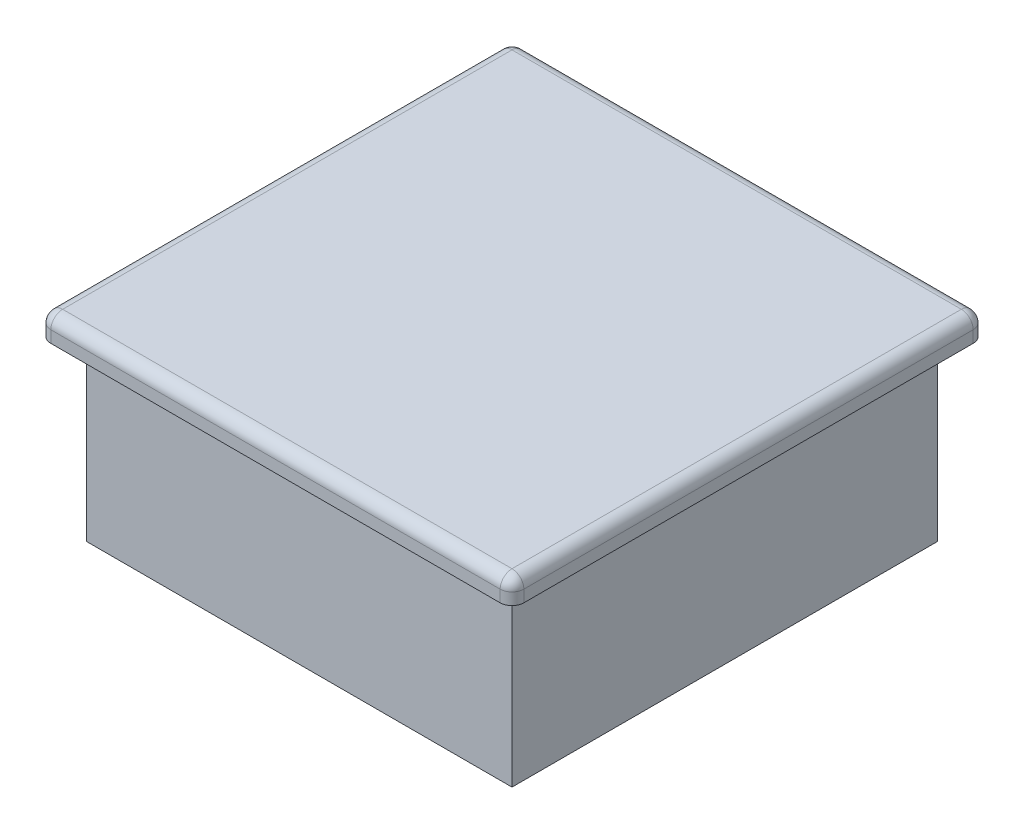
ISO-10303-21;
HEADER;
FILE_DESCRIPTION(('STEP AP214'),'2;1');
FILE_NAME('part.step','',(''),(''),'','','');
FILE_SCHEMA(('AUTOMOTIVE_DESIGN { 1 0 10303 214 1 1 1 1 }'));
ENDSEC;
DATA;
#1=APPLICATION_CONTEXT('core data for automotive mechanical design processes');
#2=APPLICATION_PROTOCOL_DEFINITION('international standard','automotive_design',2000,#1);
#3=PRODUCT_CONTEXT('',#1,'mechanical');
#4=PRODUCT('Part','Part','',(#3));
#5=PRODUCT_RELATED_PRODUCT_CATEGORY('part','',(#4));
#6=PRODUCT_DEFINITION_FORMATION('','',#4);
#7=PRODUCT_DEFINITION_CONTEXT('part definition',#1,'design');
#8=PRODUCT_DEFINITION('design','',#6,#7);
#9=PRODUCT_DEFINITION_SHAPE('','',#8);
#10=(LENGTH_UNIT() NAMED_UNIT(*) SI_UNIT(.MILLI.,.METRE.));
#11=(NAMED_UNIT(*) PLANE_ANGLE_UNIT() SI_UNIT($,.RADIAN.));
#12=(NAMED_UNIT(*) SI_UNIT($,.STERADIAN.) SOLID_ANGLE_UNIT());
#13=UNCERTAINTY_MEASURE_WITH_UNIT(LENGTH_MEASURE(1.E-05),#10,'distance_accuracy_value','');
#14=(GEOMETRIC_REPRESENTATION_CONTEXT(3) GLOBAL_UNCERTAINTY_ASSIGNED_CONTEXT((#13)) GLOBAL_UNIT_ASSIGNED_CONTEXT((#10,
#11,#12)) REPRESENTATION_CONTEXT('',''));
#15=CARTESIAN_POINT('',(0.,0.,0.));
#16=DIRECTION('',(0.,0.,1.));
#17=DIRECTION('',(1.,0.,0.));
#18=AXIS2_PLACEMENT_3D('',#15,#16,#17);
#19=CARTESIAN_POINT('',(20.,2.,-20.));
#20=DIRECTION('',(-1.,0.,0.));
#21=DIRECTION('',(0.,0.,1.));
#22=AXIS2_PLACEMENT_3D('',#19,#20,#21);
#23=PLANE('',#22);
#24=DIRECTION('',(0.,0.,-1.));
#25=VECTOR('',#24,1.);
#26=CARTESIAN_POINT('',(20.,0.,-20.));
#27=LINE('',#26,#25);
#28=CARTESIAN_POINT('',(20.,0.,19.));
#29=VERTEX_POINT('',#28);
#30=CARTESIAN_POINT('',(20.,0.,-19.));
#31=VERTEX_POINT('',#30);
#32=EDGE_CURVE('E229',#29,#31,#27,.T.);
#33=ORIENTED_EDGE('',*,*,#32,.T.);
#34=DIRECTION('',(0.,-1.,0.));
#35=VECTOR('',#34,1.);
#36=CARTESIAN_POINT('',(20.,2.,-19.));
#37=LINE('',#36,#35);
#38=CARTESIAN_POINT('',(20.,1.,-19.));
#39=VERTEX_POINT('',#38);
#40=EDGE_CURVE('E279',#31,#39,#37,.F.);
#41=ORIENTED_EDGE('',*,*,#40,.T.);
#42=DIRECTION('',(0.,0.,-1.));
#43=VECTOR('',#42,1.);
#44=CARTESIAN_POINT('',(20.,1.,20.));
#45=LINE('',#44,#43);
#46=CARTESIAN_POINT('',(20.,1.,19.));
#47=VERTEX_POINT('',#46);
#48=EDGE_CURVE('E277',#39,#47,#45,.F.);
#49=ORIENTED_EDGE('',*,*,#48,.T.);
#50=DIRECTION('',(0.,-1.,0.));
#51=VECTOR('',#50,1.);
#52=CARTESIAN_POINT('',(20.,2.,19.));
#53=LINE('',#52,#51);
#54=EDGE_CURVE('E275',#47,#29,#53,.T.);
#55=ORIENTED_EDGE('',*,*,#54,.T.);
#56=EDGE_LOOP('',(#33,#41,#49,#55));
#57=FACE_BOUND('',#56,.T.);
#58=ADVANCED_FACE('F35',(#57),#23,.F.);
#59=CARTESIAN_POINT('',(-20.,2.,-20.));
#60=DIRECTION('',(0.,0.,1.));
#61=DIRECTION('',(1.,0.,0.));
#62=AXIS2_PLACEMENT_3D('',#59,#60,#61);
#63=PLANE('',#62);
#64=DIRECTION('',(-1.,0.,0.));
#65=VECTOR('',#64,1.);
#66=CARTESIAN_POINT('',(-20.,0.,-20.));
#67=LINE('',#66,#65);
#68=CARTESIAN_POINT('',(19.,0.,-20.));
#69=VERTEX_POINT('',#68);
#70=CARTESIAN_POINT('',(-19.,0.,-20.));
#71=VERTEX_POINT('',#70);
#72=EDGE_CURVE('E237',#69,#71,#67,.T.);
#73=ORIENTED_EDGE('',*,*,#72,.T.);
#74=DIRECTION('',(0.,-1.,0.));
#75=VECTOR('',#74,1.);
#76=CARTESIAN_POINT('',(-19.,2.,-20.));
#77=LINE('',#76,#75);
#78=CARTESIAN_POINT('',(-19.,1.,-20.));
#79=VERTEX_POINT('',#78);
#80=EDGE_CURVE('E11',#71,#79,#77,.F.);
#81=ORIENTED_EDGE('',*,*,#80,.T.);
#82=DIRECTION('',(-1.,0.,0.));
#83=VECTOR('',#82,1.);
#84=CARTESIAN_POINT('',(20.,1.,-20.));
#85=LINE('',#84,#83);
#86=CARTESIAN_POINT('',(19.,1.,-20.));
#87=VERTEX_POINT('',#86);
#88=EDGE_CURVE('E44',#79,#87,#85,.F.);
#89=ORIENTED_EDGE('',*,*,#88,.T.);
#90=DIRECTION('',(0.,-1.,0.));
#91=VECTOR('',#90,1.);
#92=CARTESIAN_POINT('',(19.,2.,-20.));
#93=LINE('',#92,#91);
#94=EDGE_CURVE('E281',#87,#69,#93,.T.);
#95=ORIENTED_EDGE('',*,*,#94,.T.);
#96=EDGE_LOOP('',(#73,#81,#89,#95));
#97=FACE_BOUND('',#96,.T.);
#98=ADVANCED_FACE('F327',(#97),#63,.F.);
#99=CARTESIAN_POINT('',(-20.,2.,-20.));
#100=DIRECTION('',(1.,0.,0.));
#101=DIRECTION('',(0.,0.,-1.));
#102=AXIS2_PLACEMENT_3D('',#99,#100,#101);
#103=PLANE('',#102);
#104=DIRECTION('',(0.,0.,1.));
#105=VECTOR('',#104,1.);
#106=CARTESIAN_POINT('',(-20.,0.,-20.));
#107=LINE('',#106,#105);
#108=CARTESIAN_POINT('',(-20.,0.,-19.));
#109=VERTEX_POINT('',#108);
#110=CARTESIAN_POINT('',(-20.,0.,19.));
#111=VERTEX_POINT('',#110);
#112=EDGE_CURVE('E239',#109,#111,#107,.T.);
#113=ORIENTED_EDGE('',*,*,#112,.T.);
#114=DIRECTION('',(0.,-1.,0.));
#115=VECTOR('',#114,1.);
#116=CARTESIAN_POINT('',(-20.,2.,19.));
#117=LINE('',#116,#115);
#118=CARTESIAN_POINT('',(-20.,1.,19.));
#119=VERTEX_POINT('',#118);
#120=EDGE_CURVE('E264',#111,#119,#117,.F.);
#121=ORIENTED_EDGE('',*,*,#120,.T.);
#122=DIRECTION('',(0.,0.,1.));
#123=VECTOR('',#122,1.);
#124=CARTESIAN_POINT('',(-20.,1.,-20.));
#125=LINE('',#124,#123);
#126=CARTESIAN_POINT('',(-20.,1.,-19.));
#127=VERTEX_POINT('',#126);
#128=EDGE_CURVE('E262',#119,#127,#125,.F.);
#129=ORIENTED_EDGE('',*,*,#128,.T.);
#130=DIRECTION('',(0.,-1.,0.));
#131=VECTOR('',#130,1.);
#132=CARTESIAN_POINT('',(-20.,2.,-19.));
#133=LINE('',#132,#131);
#134=EDGE_CURVE('E260',#127,#109,#133,.T.);
#135=ORIENTED_EDGE('',*,*,#134,.T.);
#136=EDGE_LOOP('',(#113,#121,#129,#135));
#137=FACE_BOUND('',#136,.T.);
#138=ADVANCED_FACE('F373',(#137),#103,.F.);
#139=CARTESIAN_POINT('',(-20.,2.,20.));
#140=DIRECTION('',(0.,0.,-1.));
#141=DIRECTION('',(-1.,0.,0.));
#142=AXIS2_PLACEMENT_3D('',#139,#140,#141);
#143=PLANE('',#142);
#144=DIRECTION('',(1.,0.,0.));
#145=VECTOR('',#144,1.);
#146=CARTESIAN_POINT('',(-20.,1.,20.));
#147=LINE('',#146,#145);
#148=CARTESIAN_POINT('',(19.,1.,20.));
#149=VERTEX_POINT('',#148);
#150=CARTESIAN_POINT('',(-19.,1.,20.));
#151=VERTEX_POINT('',#150);
#152=EDGE_CURVE('E247',#149,#151,#147,.F.);
#153=ORIENTED_EDGE('',*,*,#152,.T.);
#154=DIRECTION('',(0.,-1.,0.));
#155=VECTOR('',#154,1.);
#156=CARTESIAN_POINT('',(-19.,2.,20.));
#157=LINE('',#156,#155);
#158=CARTESIAN_POINT('',(-19.,0.,20.));
#159=VERTEX_POINT('',#158);
#160=EDGE_CURVE('E249',#151,#159,#157,.T.);
#161=ORIENTED_EDGE('',*,*,#160,.T.);
#162=DIRECTION('',(1.,0.,0.));
#163=VECTOR('',#162,1.);
#164=CARTESIAN_POINT('',(-20.,0.,20.));
#165=LINE('',#164,#163);
#166=CARTESIAN_POINT('',(19.,0.,20.));
#167=VERTEX_POINT('',#166);
#168=EDGE_CURVE('E242',#159,#167,#165,.T.);
#169=ORIENTED_EDGE('',*,*,#168,.T.);
#170=DIRECTION('',(0.,-1.,0.));
#171=VECTOR('',#170,1.);
#172=CARTESIAN_POINT('',(19.,2.,20.));
#173=LINE('',#172,#171);
#174=EDGE_CURVE('E245',#167,#149,#173,.F.);
#175=ORIENTED_EDGE('',*,*,#174,.T.);
#176=EDGE_LOOP('',(#153,#161,#169,#175));
#177=FACE_BOUND('',#176,.T.);
#178=ADVANCED_FACE('F362',(#177),#143,.F.);
#179=CARTESIAN_POINT('',(0.,2.,0.));
#180=DIRECTION('',(0.,1.,0.));
#181=DIRECTION('',(0.,0.,1.));
#182=AXIS2_PLACEMENT_3D('',#179,#180,#181);
#183=PLANE('',#182);
#184=DIRECTION('',(1.,0.,0.));
#185=VECTOR('',#184,1.);
#186=CARTESIAN_POINT('',(20.,2.,19.));
#187=LINE('',#186,#185);
#188=CARTESIAN_POINT('',(-19.,2.,19.));
#189=VERTEX_POINT('',#188);
#190=CARTESIAN_POINT('',(19.,2.,19.));
#191=VERTEX_POINT('',#190);
#192=EDGE_CURVE('E270',#189,#191,#187,.T.);
#193=ORIENTED_EDGE('',*,*,#192,.T.);
#194=DIRECTION('',(0.,0.,-1.));
#195=VECTOR('',#194,1.);
#196=CARTESIAN_POINT('',(19.,2.,-20.));
#197=LINE('',#196,#195);
#198=CARTESIAN_POINT('',(19.,2.,-19.));
#199=VERTEX_POINT('',#198);
#200=EDGE_CURVE('E272',#191,#199,#197,.T.);
#201=ORIENTED_EDGE('',*,*,#200,.T.);
#202=DIRECTION('',(-1.,0.,0.));
#203=VECTOR('',#202,1.);
#204=CARTESIAN_POINT('',(-20.,2.,-19.));
#205=LINE('',#204,#203);
#206=CARTESIAN_POINT('',(-19.,2.,-19.));
#207=VERTEX_POINT('',#206);
#208=EDGE_CURVE('E266',#199,#207,#205,.T.);
#209=ORIENTED_EDGE('',*,*,#208,.T.);
#210=DIRECTION('',(0.,0.,1.));
#211=VECTOR('',#210,1.);
#212=CARTESIAN_POINT('',(-19.,2.,20.));
#213=LINE('',#212,#211);
#214=EDGE_CURVE('E268',#207,#189,#213,.T.);
#215=ORIENTED_EDGE('',*,*,#214,.T.);
#216=EDGE_LOOP('',(#193,#201,#209,#215));
#217=FACE_BOUND('',#216,.T.);
#218=ADVANCED_FACE('F345',(#217),#183,.T.);
#219=CARTESIAN_POINT('',(0.,0.,0.));
#220=DIRECTION('',(0.,1.,0.));
#221=DIRECTION('',(0.,0.,1.));
#222=AXIS2_PLACEMENT_3D('',#219,#220,#221);
#223=PLANE('',#222);
#224=DIRECTION('',(1.,0.,0.));
#225=VECTOR('',#224,1.);
#226=CARTESIAN_POINT('',(0.,0.,18.));
#227=LINE('',#226,#225);
#228=CARTESIAN_POINT('',(-18.,0.,18.));
#229=VERTEX_POINT('',#228);
#230=CARTESIAN_POINT('',(18.,0.,18.));
#231=VERTEX_POINT('',#230);
#232=EDGE_CURVE('E202',#229,#231,#227,.T.);
#233=ORIENTED_EDGE('',*,*,#232,.T.);
#234=DIRECTION('',(0.,0.,-1.));
#235=VECTOR('',#234,1.);
#236=CARTESIAN_POINT('',(18.,0.,0.));
#237=LINE('',#236,#235);
#238=CARTESIAN_POINT('',(18.,0.,-18.));
#239=VERTEX_POINT('',#238);
#240=EDGE_CURVE('E164',#231,#239,#237,.T.);
#241=ORIENTED_EDGE('',*,*,#240,.T.);
#242=DIRECTION('',(1.,0.,0.));
#243=VECTOR('',#242,1.);
#244=CARTESIAN_POINT('',(0.,0.,-18.));
#245=LINE('',#244,#243);
#246=CARTESIAN_POINT('',(-18.,0.,-18.));
#247=VERTEX_POINT('',#246);
#248=EDGE_CURVE('E207',#247,#239,#245,.T.);
#249=ORIENTED_EDGE('',*,*,#248,.F.);
#250=DIRECTION('',(0.,0.,-1.));
#251=VECTOR('',#250,1.);
#252=CARTESIAN_POINT('',(-18.,0.,0.));
#253=LINE('',#252,#251);
#254=EDGE_CURVE('E204',#229,#247,#253,.T.);
#255=ORIENTED_EDGE('',*,*,#254,.F.);
#256=EDGE_LOOP('',(#233,#241,#249,#255));
#257=FACE_BOUND('',#256,.T.);
#258=ORIENTED_EDGE('',*,*,#168,.F.);
#259=CARTESIAN_POINT('',(-19.,0.,19.));
#260=DIRECTION('',(0.,1.,0.));
#261=DIRECTION('',(0.,0.,1.));
#262=AXIS2_PLACEMENT_3D('',#259,#260,#261);
#263=CIRCLE('',#262,1.);
#264=EDGE_CURVE('E258',#159,#111,#263,.F.);
#265=ORIENTED_EDGE('',*,*,#264,.T.);
#266=ORIENTED_EDGE('',*,*,#112,.F.);
#267=CARTESIAN_POINT('',(-19.,0.,-19.));
#268=DIRECTION('',(0.,1.,0.));
#269=DIRECTION('',(0.,0.,1.));
#270=AXIS2_PLACEMENT_3D('',#267,#268,#269);
#271=CIRCLE('',#270,1.);
#272=EDGE_CURVE('E256',#109,#71,#271,.F.);
#273=ORIENTED_EDGE('',*,*,#272,.T.);
#274=ORIENTED_EDGE('',*,*,#72,.F.);
#275=CARTESIAN_POINT('',(19.,0.,-19.));
#276=DIRECTION('',(0.,1.,0.));
#277=DIRECTION('',(0.,0.,1.));
#278=AXIS2_PLACEMENT_3D('',#275,#276,#277);
#279=CIRCLE('',#278,1.);
#280=EDGE_CURVE('E254',#69,#31,#279,.F.);
#281=ORIENTED_EDGE('',*,*,#280,.T.);
#282=ORIENTED_EDGE('',*,*,#32,.F.);
#283=CARTESIAN_POINT('',(19.,0.,19.));
#284=DIRECTION('',(0.,1.,0.));
#285=DIRECTION('',(0.,0.,1.));
#286=AXIS2_PLACEMENT_3D('',#283,#284,#285);
#287=CIRCLE('',#286,1.);
#288=EDGE_CURVE('E252',#29,#167,#287,.F.);
#289=ORIENTED_EDGE('',*,*,#288,.T.);
#290=EDGE_LOOP('',(#258,#265,#266,#273,#274,#281,#282,#289));
#291=FACE_BOUND('',#290,.T.);
#292=ADVANCED_FACE('F330',(#257,#291),#223,.F.);
#293=CARTESIAN_POINT('',(0.,-15.,-16.));
#294=DIRECTION('',(0.,0.,-1.));
#295=DIRECTION('',(-1.,0.,0.));
#296=AXIS2_PLACEMENT_3D('',#293,#294,#295);
#297=PLANE('',#296);
#298=DIRECTION('',(-1.,0.,0.));
#299=VECTOR('',#298,1.);
#300=CARTESIAN_POINT('',(0.,0.,-16.));
#301=LINE('',#300,#299);
#302=CARTESIAN_POINT('',(16.,0.,-16.));
#303=VERTEX_POINT('',#302);
#304=CARTESIAN_POINT('',(-16.,0.,-16.));
#305=VERTEX_POINT('',#304);
#306=EDGE_CURVE('E210',#303,#305,#301,.T.);
#307=ORIENTED_EDGE('',*,*,#306,.T.);
#308=DIRECTION('',(0.,1.,0.));
#309=VECTOR('',#308,1.);
#310=CARTESIAN_POINT('',(-16.,-15.,-16.));
#311=LINE('',#310,#309);
#312=CARTESIAN_POINT('',(-16.,-15.,-16.));
#313=VERTEX_POINT('',#312);
#314=EDGE_CURVE('E227',#313,#305,#311,.T.);
#315=ORIENTED_EDGE('',*,*,#314,.F.);
#316=DIRECTION('',(-1.,0.,0.));
#317=VECTOR('',#316,1.);
#318=CARTESIAN_POINT('',(0.,-15.,-16.));
#319=LINE('',#318,#317);
#320=CARTESIAN_POINT('',(16.,-15.,-16.));
#321=VERTEX_POINT('',#320);
#322=EDGE_CURVE('E189',#321,#313,#319,.T.);
#323=ORIENTED_EDGE('',*,*,#322,.F.);
#324=DIRECTION('',(0.,1.,0.));
#325=VECTOR('',#324,1.);
#326=CARTESIAN_POINT('',(16.,-15.,-16.));
#327=LINE('',#326,#325);
#328=EDGE_CURVE('E168',#321,#303,#327,.T.);
#329=ORIENTED_EDGE('',*,*,#328,.T.);
#330=EDGE_LOOP('',(#307,#315,#323,#329));
#331=FACE_BOUND('',#330,.T.);
#332=ADVANCED_FACE('F540',(#331),#297,.F.);
#333=CARTESIAN_POINT('',(-16.,-15.,0.));
#334=DIRECTION('',(-1.,0.,0.));
#335=DIRECTION('',(0.,0.,1.));
#336=AXIS2_PLACEMENT_3D('',#333,#334,#335);
#337=PLANE('',#336);
#338=DIRECTION('',(0.,0.,1.));
#339=VECTOR('',#338,1.);
#340=CARTESIAN_POINT('',(-16.,0.,0.));
#341=LINE('',#340,#339);
#342=CARTESIAN_POINT('',(-16.,0.,16.));
#343=VERTEX_POINT('',#342);
#344=EDGE_CURVE('E213',#305,#343,#341,.T.);
#345=ORIENTED_EDGE('',*,*,#344,.T.);
#346=DIRECTION('',(0.,1.,0.));
#347=VECTOR('',#346,1.);
#348=CARTESIAN_POINT('',(-16.,-15.,16.));
#349=LINE('',#348,#347);
#350=CARTESIAN_POINT('',(-16.,-15.,16.));
#351=VERTEX_POINT('',#350);
#352=EDGE_CURVE('E225',#351,#343,#349,.T.);
#353=ORIENTED_EDGE('',*,*,#352,.F.);
#354=DIRECTION('',(0.,0.,1.));
#355=VECTOR('',#354,1.);
#356=CARTESIAN_POINT('',(-16.,-15.,0.));
#357=LINE('',#356,#355);
#358=EDGE_CURVE('E192',#313,#351,#357,.T.);
#359=ORIENTED_EDGE('',*,*,#358,.F.);
#360=ORIENTED_EDGE('',*,*,#314,.T.);
#361=EDGE_LOOP('',(#345,#353,#359,#360));
#362=FACE_BOUND('',#361,.T.);
#363=ADVANCED_FACE('F531',(#362),#337,.F.);
#364=CARTESIAN_POINT('',(0.,-15.,16.));
#365=DIRECTION('',(0.,0.,-1.));
#366=DIRECTION('',(-1.,0.,0.));
#367=AXIS2_PLACEMENT_3D('',#364,#365,#366);
#368=PLANE('',#367);
#369=DIRECTION('',(-1.,0.,0.));
#370=VECTOR('',#369,1.);
#371=CARTESIAN_POINT('',(0.,0.,16.));
#372=LINE('',#371,#370);
#373=CARTESIAN_POINT('',(16.,0.,16.));
#374=VERTEX_POINT('',#373);
#375=EDGE_CURVE('E216',#374,#343,#372,.T.);
#376=ORIENTED_EDGE('',*,*,#375,.F.);
#377=DIRECTION('',(0.,1.,0.));
#378=VECTOR('',#377,1.);
#379=CARTESIAN_POINT('',(16.,-15.,16.));
#380=LINE('',#379,#378);
#381=CARTESIAN_POINT('',(16.,-15.,16.));
#382=VERTEX_POINT('',#381);
#383=EDGE_CURVE('E222',#382,#374,#380,.T.);
#384=ORIENTED_EDGE('',*,*,#383,.F.);
#385=DIRECTION('',(-1.,0.,0.));
#386=VECTOR('',#385,1.);
#387=CARTESIAN_POINT('',(0.,-15.,16.));
#388=LINE('',#387,#386);
#389=EDGE_CURVE('E194',#382,#351,#388,.T.);
#390=ORIENTED_EDGE('',*,*,#389,.T.);
#391=ORIENTED_EDGE('',*,*,#352,.T.);
#392=EDGE_LOOP('',(#376,#384,#390,#391));
#393=FACE_BOUND('',#392,.T.);
#394=ADVANCED_FACE('F523',(#393),#368,.T.);
#395=CARTESIAN_POINT('',(18.,-15.,0.));
#396=DIRECTION('',(1.,0.,0.));
#397=DIRECTION('',(0.,0.,-1.));
#398=AXIS2_PLACEMENT_3D('',#395,#396,#397);
#399=PLANE('',#398);
#400=ORIENTED_EDGE('',*,*,#240,.F.);
#401=DIRECTION('',(0.,1.,0.));
#402=VECTOR('',#401,1.);
#403=CARTESIAN_POINT('',(18.,-15.,18.));
#404=LINE('',#403,#402);
#405=CARTESIAN_POINT('',(18.,-15.,18.));
#406=VERTEX_POINT('',#405);
#407=EDGE_CURVE('E159',#406,#231,#404,.T.);
#408=ORIENTED_EDGE('',*,*,#407,.F.);
#409=DIRECTION('',(0.,0.,-1.));
#410=VECTOR('',#409,1.);
#411=CARTESIAN_POINT('',(18.,-15.,0.));
#412=LINE('',#411,#410);
#413=CARTESIAN_POINT('',(18.,-15.,-18.));
#414=VERTEX_POINT('',#413);
#415=EDGE_CURVE('E163',#406,#414,#412,.T.);
#416=ORIENTED_EDGE('',*,*,#415,.T.);
#417=DIRECTION('',(0.,1.,0.));
#418=VECTOR('',#417,1.);
#419=CARTESIAN_POINT('',(18.,-15.,-18.));
#420=LINE('',#419,#418);
#421=EDGE_CURVE('E200',#414,#239,#420,.T.);
#422=ORIENTED_EDGE('',*,*,#421,.T.);
#423=EDGE_LOOP('',(#400,#408,#416,#422));
#424=FACE_BOUND('',#423,.T.);
#425=ADVANCED_FACE('F161',(#424),#399,.T.);
#426=CARTESIAN_POINT('',(0.,-15.,18.));
#427=DIRECTION('',(0.,0.,1.));
#428=DIRECTION('',(1.,0.,0.));
#429=AXIS2_PLACEMENT_3D('',#426,#427,#428);
#430=PLANE('',#429);
#431=ORIENTED_EDGE('',*,*,#232,.F.);
#432=DIRECTION('',(0.,1.,0.));
#433=VECTOR('',#432,1.);
#434=CARTESIAN_POINT('',(-18.,-15.,18.));
#435=LINE('',#434,#433);
#436=CARTESIAN_POINT('',(-18.,-15.,18.));
#437=VERTEX_POINT('',#436);
#438=EDGE_CURVE('E169',#437,#229,#435,.T.);
#439=ORIENTED_EDGE('',*,*,#438,.F.);
#440=DIRECTION('',(1.,0.,0.));
#441=VECTOR('',#440,1.);
#442=CARTESIAN_POINT('',(0.,-15.,18.));
#443=LINE('',#442,#441);
#444=EDGE_CURVE('E175',#437,#406,#443,.T.);
#445=ORIENTED_EDGE('',*,*,#444,.T.);
#446=ORIENTED_EDGE('',*,*,#407,.T.);
#447=EDGE_LOOP('',(#431,#439,#445,#446));
#448=FACE_BOUND('',#447,.T.);
#449=ADVANCED_FACE('F181',(#448),#430,.T.);
#450=CARTESIAN_POINT('',(-18.,-15.,0.));
#451=DIRECTION('',(1.,0.,0.));
#452=DIRECTION('',(0.,0.,-1.));
#453=AXIS2_PLACEMENT_3D('',#450,#451,#452);
#454=PLANE('',#453);
#455=ORIENTED_EDGE('',*,*,#254,.T.);
#456=DIRECTION('',(0.,1.,0.));
#457=VECTOR('',#456,1.);
#458=CARTESIAN_POINT('',(-18.,-15.,-18.));
#459=LINE('',#458,#457);
#460=CARTESIAN_POINT('',(-18.,-15.,-18.));
#461=VERTEX_POINT('',#460);
#462=EDGE_CURVE('E231',#461,#247,#459,.T.);
#463=ORIENTED_EDGE('',*,*,#462,.F.);
#464=DIRECTION('',(0.,0.,-1.));
#465=VECTOR('',#464,1.);
#466=CARTESIAN_POINT('',(-18.,-15.,0.));
#467=LINE('',#466,#465);
#468=EDGE_CURVE('E184',#437,#461,#467,.T.);
#469=ORIENTED_EDGE('',*,*,#468,.F.);
#470=ORIENTED_EDGE('',*,*,#438,.T.);
#471=EDGE_LOOP('',(#455,#463,#469,#470));
#472=FACE_BOUND('',#471,.T.);
#473=ADVANCED_FACE('F499',(#472),#454,.F.);
#474=CARTESIAN_POINT('',(0.,-15.,-18.));
#475=DIRECTION('',(0.,0.,1.));
#476=DIRECTION('',(1.,0.,0.));
#477=AXIS2_PLACEMENT_3D('',#474,#475,#476);
#478=PLANE('',#477);
#479=ORIENTED_EDGE('',*,*,#248,.T.);
#480=ORIENTED_EDGE('',*,*,#421,.F.);
#481=DIRECTION('',(1.,0.,0.));
#482=VECTOR('',#481,1.);
#483=CARTESIAN_POINT('',(0.,-15.,-18.));
#484=LINE('',#483,#482);
#485=EDGE_CURVE('E177',#461,#414,#484,.T.);
#486=ORIENTED_EDGE('',*,*,#485,.F.);
#487=ORIENTED_EDGE('',*,*,#462,.T.);
#488=EDGE_LOOP('',(#479,#480,#486,#487));
#489=FACE_BOUND('',#488,.T.);
#490=ADVANCED_FACE('F490',(#489),#478,.F.);
#491=CARTESIAN_POINT('',(16.,-15.,0.));
#492=DIRECTION('',(-1.,0.,0.));
#493=DIRECTION('',(0.,0.,1.));
#494=AXIS2_PLACEMENT_3D('',#491,#492,#493);
#495=PLANE('',#494);
#496=DIRECTION('',(0.,0.,1.));
#497=VECTOR('',#496,1.);
#498=CARTESIAN_POINT('',(16.,0.,0.));
#499=LINE('',#498,#497);
#500=EDGE_CURVE('E179',#303,#374,#499,.T.);
#501=ORIENTED_EDGE('',*,*,#500,.F.);
#502=ORIENTED_EDGE('',*,*,#328,.F.);
#503=DIRECTION('',(0.,0.,1.));
#504=VECTOR('',#503,1.);
#505=CARTESIAN_POINT('',(16.,-15.,0.));
#506=LINE('',#505,#504);
#507=EDGE_CURVE('E197',#321,#382,#506,.T.);
#508=ORIENTED_EDGE('',*,*,#507,.T.);
#509=ORIENTED_EDGE('',*,*,#383,.T.);
#510=EDGE_LOOP('',(#501,#502,#508,#509));
#511=FACE_BOUND('',#510,.T.);
#512=ADVANCED_FACE('F481',(#511),#495,.T.);
#513=CARTESIAN_POINT('',(0.,-15.,0.));
#514=DIRECTION('',(0.,-1.,0.));
#515=DIRECTION('',(0.,0.,-1.));
#516=AXIS2_PLACEMENT_3D('',#513,#514,#515);
#517=PLANE('',#516);
#518=ORIENTED_EDGE('',*,*,#415,.F.);
#519=ORIENTED_EDGE('',*,*,#444,.F.);
#520=ORIENTED_EDGE('',*,*,#468,.T.);
#521=ORIENTED_EDGE('',*,*,#485,.T.);
#522=EDGE_LOOP('',(#518,#519,#520,#521));
#523=FACE_BOUND('',#522,.T.);
#524=ORIENTED_EDGE('',*,*,#322,.T.);
#525=ORIENTED_EDGE('',*,*,#358,.T.);
#526=ORIENTED_EDGE('',*,*,#389,.F.);
#527=ORIENTED_EDGE('',*,*,#507,.F.);
#528=EDGE_LOOP('',(#524,#525,#526,#527));
#529=FACE_BOUND('',#528,.T.);
#530=ADVANCED_FACE('F173',(#523,#529),#517,.T.);
#531=ORIENTED_EDGE('',*,*,#306,.F.);
#532=ORIENTED_EDGE('',*,*,#500,.T.);
#533=ORIENTED_EDGE('',*,*,#375,.T.);
#534=ORIENTED_EDGE('',*,*,#344,.F.);
#535=EDGE_LOOP('',(#531,#532,#533,#534));
#536=FACE_BOUND('',#535,.T.);
#537=ADVANCED_FACE('F473',(#536),#223,.F.);
#538=CARTESIAN_POINT('',(19.,2.,-19.));
#539=DIRECTION('',(0.,-1.,0.));
#540=DIRECTION('',(0.,0.,-1.));
#541=AXIS2_PLACEMENT_3D('',#538,#539,#540);
#542=CYLINDRICAL_SURFACE('',#541,1.);
#543=CARTESIAN_POINT('',(19.,1.,-19.));
#544=DIRECTION('',(0.,1.,0.));
#545=DIRECTION('',(0.,0.,1.));
#546=AXIS2_PLACEMENT_3D('',#543,#544,#545);
#547=CIRCLE('',#546,1.);
#548=EDGE_CURVE('E39',#39,#87,#547,.T.);
#549=ORIENTED_EDGE('',*,*,#548,.F.);
#550=ORIENTED_EDGE('',*,*,#40,.F.);
#551=ORIENTED_EDGE('',*,*,#280,.F.);
#552=ORIENTED_EDGE('',*,*,#94,.F.);
#553=EDGE_LOOP('',(#549,#550,#551,#552));
#554=FACE_BOUND('',#553,.T.);
#555=ADVANCED_FACE('F37',(#554),#542,.T.);
#556=CARTESIAN_POINT('',(19.,1.,-19.));
#557=DIRECTION('',(0.,0.,1.));
#558=DIRECTION('',(1.,0.,0.));
#559=AXIS2_PLACEMENT_3D('',#556,#557,#558);
#560=SPHERICAL_SURFACE('',#559,1.);
#561=CARTESIAN_POINT('',(19.,1.,-19.));
#562=DIRECTION('',(0.,0.,-1.));
#563=DIRECTION('',(-1.,0.,0.));
#564=AXIS2_PLACEMENT_3D('',#561,#562,#563);
#565=CIRCLE('',#564,1.);
#566=EDGE_CURVE('E311',#39,#199,#565,.F.);
#567=ORIENTED_EDGE('',*,*,#566,.F.);
#568=ORIENTED_EDGE('',*,*,#548,.T.);
#569=CARTESIAN_POINT('',(19.,1.,-19.));
#570=DIRECTION('',(1.,0.,0.));
#571=DIRECTION('',(0.,0.,-1.));
#572=AXIS2_PLACEMENT_3D('',#569,#570,#571);
#573=CIRCLE('',#572,1.);
#574=EDGE_CURVE('E313',#199,#87,#573,.F.);
#575=ORIENTED_EDGE('',*,*,#574,.F.);
#576=EDGE_LOOP('',(#567,#568,#575));
#577=FACE_BOUND('',#576,.T.);
#578=ADVANCED_FACE('F321',(#577),#560,.T.);
#579=CARTESIAN_POINT('',(-19.,2.,-19.));
#580=DIRECTION('',(0.,-1.,0.));
#581=DIRECTION('',(0.,0.,-1.));
#582=AXIS2_PLACEMENT_3D('',#579,#580,#581);
#583=CYLINDRICAL_SURFACE('',#582,1.);
#584=ORIENTED_EDGE('',*,*,#272,.F.);
#585=ORIENTED_EDGE('',*,*,#134,.F.);
#586=CARTESIAN_POINT('',(-19.,1.,-19.));
#587=DIRECTION('',(0.,1.,0.));
#588=DIRECTION('',(0.,0.,1.));
#589=AXIS2_PLACEMENT_3D('',#586,#587,#588);
#590=CIRCLE('',#589,1.);
#591=EDGE_CURVE('E308',#79,#127,#590,.T.);
#592=ORIENTED_EDGE('',*,*,#591,.F.);
#593=ORIENTED_EDGE('',*,*,#80,.F.);
#594=EDGE_LOOP('',(#584,#585,#592,#593));
#595=FACE_BOUND('',#594,.T.);
#596=ADVANCED_FACE('F336',(#595),#583,.T.);
#597=CARTESIAN_POINT('',(0.,1.,-19.));
#598=DIRECTION('',(1.,0.,0.));
#599=DIRECTION('',(0.,0.,-1.));
#600=AXIS2_PLACEMENT_3D('',#597,#598,#599);
#601=CYLINDRICAL_SURFACE('',#600,1.);
#602=ORIENTED_EDGE('',*,*,#574,.T.);
#603=ORIENTED_EDGE('',*,*,#88,.F.);
#604=CARTESIAN_POINT('',(-19.,1.,-19.));
#605=DIRECTION('',(-1.,0.,0.));
#606=DIRECTION('',(0.,0.,1.));
#607=AXIS2_PLACEMENT_3D('',#604,#605,#606);
#608=CIRCLE('',#607,1.);
#609=EDGE_CURVE('E305',#207,#79,#608,.T.);
#610=ORIENTED_EDGE('',*,*,#609,.F.);
#611=ORIENTED_EDGE('',*,*,#208,.F.);
#612=EDGE_LOOP('',(#602,#603,#610,#611));
#613=FACE_BOUND('',#612,.T.);
#614=ADVANCED_FACE('F343',(#613),#601,.T.);
#615=CARTESIAN_POINT('',(19.,1.,0.));
#616=DIRECTION('',(0.,0.,1.));
#617=DIRECTION('',(1.,0.,0.));
#618=AXIS2_PLACEMENT_3D('',#615,#616,#617);
#619=CYLINDRICAL_SURFACE('',#618,1.);
#620=ORIENTED_EDGE('',*,*,#566,.T.);
#621=ORIENTED_EDGE('',*,*,#200,.F.);
#622=CARTESIAN_POINT('',(19.,1.,19.));
#623=DIRECTION('',(0.,0.,1.));
#624=DIRECTION('',(1.,0.,0.));
#625=AXIS2_PLACEMENT_3D('',#622,#623,#624);
#626=CIRCLE('',#625,1.);
#627=EDGE_CURVE('E302',#47,#191,#626,.T.);
#628=ORIENTED_EDGE('',*,*,#627,.F.);
#629=ORIENTED_EDGE('',*,*,#48,.F.);
#630=EDGE_LOOP('',(#620,#621,#628,#629));
#631=FACE_BOUND('',#630,.T.);
#632=ADVANCED_FACE('F350',(#631),#619,.T.);
#633=CARTESIAN_POINT('',(19.,2.,19.));
#634=DIRECTION('',(0.,-1.,0.));
#635=DIRECTION('',(0.,0.,-1.));
#636=AXIS2_PLACEMENT_3D('',#633,#634,#635);
#637=CYLINDRICAL_SURFACE('',#636,1.);
#638=ORIENTED_EDGE('',*,*,#288,.F.);
#639=ORIENTED_EDGE('',*,*,#54,.F.);
#640=CARTESIAN_POINT('',(19.,1.,19.));
#641=DIRECTION('',(0.,1.,0.));
#642=DIRECTION('',(0.,0.,1.));
#643=AXIS2_PLACEMENT_3D('',#640,#641,#642);
#644=CIRCLE('',#643,1.);
#645=EDGE_CURVE('E299',#149,#47,#644,.T.);
#646=ORIENTED_EDGE('',*,*,#645,.F.);
#647=ORIENTED_EDGE('',*,*,#174,.F.);
#648=EDGE_LOOP('',(#638,#639,#646,#647));
#649=FACE_BOUND('',#648,.T.);
#650=ADVANCED_FACE('F368',(#649),#637,.T.);
#651=CARTESIAN_POINT('',(-19.,1.,-19.));
#652=DIRECTION('',(0.,0.,1.));
#653=DIRECTION('',(1.,0.,0.));
#654=AXIS2_PLACEMENT_3D('',#651,#652,#653);
#655=SPHERICAL_SURFACE('',#654,1.);
#656=ORIENTED_EDGE('',*,*,#609,.T.);
#657=ORIENTED_EDGE('',*,*,#591,.T.);
#658=CARTESIAN_POINT('',(-19.,1.,-19.));
#659=DIRECTION('',(0.,0.,-1.));
#660=DIRECTION('',(-1.,0.,0.));
#661=AXIS2_PLACEMENT_3D('',#658,#659,#660);
#662=CIRCLE('',#661,1.);
#663=EDGE_CURVE('E296',#207,#127,#662,.F.);
#664=ORIENTED_EDGE('',*,*,#663,.F.);
#665=EDGE_LOOP('',(#656,#657,#664));
#666=FACE_BOUND('',#665,.T.);
#667=ADVANCED_FACE('F341',(#666),#655,.T.);
#668=CARTESIAN_POINT('',(19.,1.,19.));
#669=DIRECTION('',(0.,0.,1.));
#670=DIRECTION('',(1.,0.,0.));
#671=AXIS2_PLACEMENT_3D('',#668,#669,#670);
#672=SPHERICAL_SURFACE('',#671,1.);
#673=ORIENTED_EDGE('',*,*,#645,.T.);
#674=ORIENTED_EDGE('',*,*,#627,.T.);
#675=CARTESIAN_POINT('',(19.,1.,19.));
#676=DIRECTION('',(1.,0.,0.));
#677=DIRECTION('',(0.,0.,-1.));
#678=AXIS2_PLACEMENT_3D('',#675,#676,#677);
#679=CIRCLE('',#678,1.);
#680=EDGE_CURVE('E293',#149,#191,#679,.F.);
#681=ORIENTED_EDGE('',*,*,#680,.F.);
#682=EDGE_LOOP('',(#673,#674,#681));
#683=FACE_BOUND('',#682,.T.);
#684=ADVANCED_FACE('F353',(#683),#672,.T.);
#685=CARTESIAN_POINT('',(-19.,1.,0.));
#686=DIRECTION('',(0.,0.,-1.));
#687=DIRECTION('',(-1.,0.,0.));
#688=AXIS2_PLACEMENT_3D('',#685,#686,#687);
#689=CYLINDRICAL_SURFACE('',#688,1.);
#690=ORIENTED_EDGE('',*,*,#663,.T.);
#691=ORIENTED_EDGE('',*,*,#128,.F.);
#692=CARTESIAN_POINT('',(-19.,1.,19.));
#693=DIRECTION('',(0.,0.,1.));
#694=DIRECTION('',(1.,0.,0.));
#695=AXIS2_PLACEMENT_3D('',#692,#693,#694);
#696=CIRCLE('',#695,1.);
#697=EDGE_CURVE('E290',#189,#119,#696,.T.);
#698=ORIENTED_EDGE('',*,*,#697,.F.);
#699=ORIENTED_EDGE('',*,*,#214,.F.);
#700=EDGE_LOOP('',(#690,#691,#698,#699));
#701=FACE_BOUND('',#700,.T.);
#702=ADVANCED_FACE('F379',(#701),#689,.T.);
#703=CARTESIAN_POINT('',(0.,1.,19.));
#704=DIRECTION('',(-1.,0.,0.));
#705=DIRECTION('',(0.,0.,1.));
#706=AXIS2_PLACEMENT_3D('',#703,#704,#705);
#707=CYLINDRICAL_SURFACE('',#706,1.);
#708=ORIENTED_EDGE('',*,*,#680,.T.);
#709=ORIENTED_EDGE('',*,*,#192,.F.);
#710=CARTESIAN_POINT('',(-19.,1.,19.));
#711=DIRECTION('',(-1.,0.,0.));
#712=DIRECTION('',(0.,0.,1.));
#713=AXIS2_PLACEMENT_3D('',#710,#711,#712);
#714=CIRCLE('',#713,1.);
#715=EDGE_CURVE('E287',#151,#189,#714,.T.);
#716=ORIENTED_EDGE('',*,*,#715,.F.);
#717=ORIENTED_EDGE('',*,*,#152,.F.);
#718=EDGE_LOOP('',(#708,#709,#716,#717));
#719=FACE_BOUND('',#718,.T.);
#720=ADVANCED_FACE('F357',(#719),#707,.T.);
#721=CARTESIAN_POINT('',(-19.,1.,19.));
#722=DIRECTION('',(0.,0.,1.));
#723=DIRECTION('',(1.,0.,0.));
#724=AXIS2_PLACEMENT_3D('',#721,#722,#723);
#725=SPHERICAL_SURFACE('',#724,1.);
#726=ORIENTED_EDGE('',*,*,#715,.T.);
#727=ORIENTED_EDGE('',*,*,#697,.T.);
#728=CARTESIAN_POINT('',(-19.,1.,19.));
#729=DIRECTION('',(0.,1.,0.));
#730=DIRECTION('',(0.,0.,1.));
#731=AXIS2_PLACEMENT_3D('',#728,#729,#730);
#732=CIRCLE('',#731,1.);
#733=EDGE_CURVE('E284',#151,#119,#732,.F.);
#734=ORIENTED_EDGE('',*,*,#733,.F.);
#735=EDGE_LOOP('',(#726,#727,#734));
#736=FACE_BOUND('',#735,.T.);
#737=ADVANCED_FACE('F377',(#736),#725,.T.);
#738=CARTESIAN_POINT('',(-19.,2.,19.));
#739=DIRECTION('',(0.,-1.,0.));
#740=DIRECTION('',(0.,0.,-1.));
#741=AXIS2_PLACEMENT_3D('',#738,#739,#740);
#742=CYLINDRICAL_SURFACE('',#741,1.);
#743=ORIENTED_EDGE('',*,*,#733,.T.);
#744=ORIENTED_EDGE('',*,*,#120,.F.);
#745=ORIENTED_EDGE('',*,*,#264,.F.);
#746=ORIENTED_EDGE('',*,*,#160,.F.);
#747=EDGE_LOOP('',(#743,#744,#745,#746));
#748=FACE_BOUND('',#747,.T.);
#749=ADVANCED_FACE('F375',(#748),#742,.T.);
#750=CLOSED_SHELL('',(#58,#98,#138,#178,#218,#292,#332,#363,#394,#425,#449,#473,#490,#512,#530,
#537,#555,#578,#596,#614,#632,#650,#667,#684,#702,#720,#737,#749));
#751=MANIFOLD_SOLID_BREP('B2',#750);
#752=ADVANCED_BREP_SHAPE_REPRESENTATION('',(#18,#751),#14);
#753=SHAPE_DEFINITION_REPRESENTATION(#9,#752);
ENDSEC;
END-ISO-10303-21;
